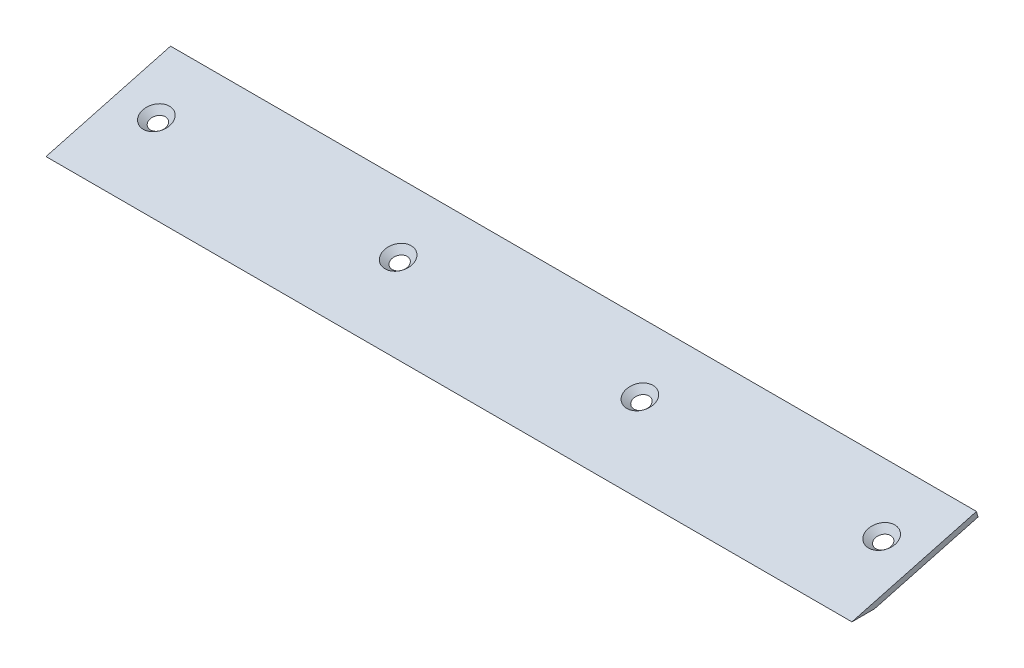
ISO-10303-21;
HEADER;
FILE_DESCRIPTION(('STEP AP214'),'2;1');
FILE_NAME('part.step','',(''),(''),'','','');
FILE_SCHEMA(('AUTOMOTIVE_DESIGN { 1 0 10303 214 1 1 1 1 }'));
ENDSEC;
DATA;
#1=APPLICATION_CONTEXT('core data for automotive mechanical design processes');
#2=APPLICATION_PROTOCOL_DEFINITION('international standard','automotive_design',2000,#1);
#3=PRODUCT_CONTEXT('',#1,'mechanical');
#4=PRODUCT('Part','Part','',(#3));
#5=PRODUCT_RELATED_PRODUCT_CATEGORY('part','',(#4));
#6=PRODUCT_DEFINITION_FORMATION('','',#4);
#7=PRODUCT_DEFINITION_CONTEXT('part definition',#1,'design');
#8=PRODUCT_DEFINITION('design','',#6,#7);
#9=PRODUCT_DEFINITION_SHAPE('','',#8);
#10=(LENGTH_UNIT() NAMED_UNIT(*) SI_UNIT(.MILLI.,.METRE.));
#11=(NAMED_UNIT(*) PLANE_ANGLE_UNIT() SI_UNIT($,.RADIAN.));
#12=(NAMED_UNIT(*) SI_UNIT($,.STERADIAN.) SOLID_ANGLE_UNIT());
#13=UNCERTAINTY_MEASURE_WITH_UNIT(LENGTH_MEASURE(1.E-05),#10,'distance_accuracy_value','');
#14=(GEOMETRIC_REPRESENTATION_CONTEXT(3) GLOBAL_UNCERTAINTY_ASSIGNED_CONTEXT((#13)) GLOBAL_UNIT_ASSIGNED_CONTEXT((#10,
#11,#12)) REPRESENTATION_CONTEXT('',''));
#15=CARTESIAN_POINT('',(0.,0.,0.));
#16=DIRECTION('',(0.,0.,1.));
#17=DIRECTION('',(1.,0.,0.));
#18=AXIS2_PLACEMENT_3D('',#15,#16,#17);
#19=CARTESIAN_POINT('',(-200.,0.,-5.60236979247659));
#20=DIRECTION('',(0.,-1.,0.));
#21=DIRECTION('',(0.,0.,-1.));
#22=AXIS2_PLACEMENT_3D('',#19,#20,#21);
#23=PLANE('',#22);
#24=DIRECTION('',(0.,0.,-1.));
#25=VECTOR('',#24,1.);
#26=CARTESIAN_POINT('',(0.,0.,-5.60236979247659));
#27=LINE('',#26,#25);
#28=CARTESIAN_POINT('',(0.,0.,0.));
#29=VERTEX_POINT('',#28);
#30=CARTESIAN_POINT('',(0.,0.,-5.60236979247659));
#31=VERTEX_POINT('',#30);
#32=EDGE_CURVE('E112',#29,#31,#27,.T.);
#33=ORIENTED_EDGE('',*,*,#32,.F.);
#34=DIRECTION('',(1.,0.,0.));
#35=VECTOR('',#34,1.);
#36=CARTESIAN_POINT('',(-200.,0.,0.));
#37=LINE('',#36,#35);
#38=CARTESIAN_POINT('',(-200.,0.,0.));
#39=VERTEX_POINT('',#38);
#40=EDGE_CURVE('E11',#39,#29,#37,.T.);
#41=ORIENTED_EDGE('',*,*,#40,.F.);
#42=DIRECTION('',(0.,0.,-1.));
#43=VECTOR('',#42,1.);
#44=CARTESIAN_POINT('',(-200.,0.,-5.60236979247659));
#45=LINE('',#44,#43);
#46=CARTESIAN_POINT('',(-200.,0.,-5.60236979247659));
#47=VERTEX_POINT('',#46);
#48=EDGE_CURVE('E103',#39,#47,#45,.T.);
#49=ORIENTED_EDGE('',*,*,#48,.T.);
#50=DIRECTION('',(1.,0.,0.));
#51=VECTOR('',#50,1.);
#52=CARTESIAN_POINT('',(-200.,0.,-5.60236979247659));
#53=LINE('',#52,#51);
#54=EDGE_CURVE('E83',#47,#31,#53,.T.);
#55=ORIENTED_EDGE('',*,*,#54,.T.);
#56=EDGE_LOOP('',(#33,#41,#49,#55));
#57=FACE_BOUND('',#56,.T.);
#58=ADVANCED_FACE('F39',(#57),#23,.T.);
#59=CARTESIAN_POINT('',(-200.,0.,0.));
#60=DIRECTION('',(0.,0.965925826289068,0.258819045102522));
#61=DIRECTION('',(0.,-0.258819045102522,0.965925826289068));
#62=AXIS2_PLACEMENT_3D('',#59,#60,#61);
#63=PLANE('',#62);
#64=CARTESIAN_POINT('',(-190.,4.65874281184539,-17.3866648732032));
#65=DIRECTION('',(0.,0.965925826289068,0.258819045102522));
#66=DIRECTION('',(0.,-0.258819045102522,0.965925826289068));
#67=AXIS2_PLACEMENT_3D('',#64,#65,#66);
#68=CIRCLE('',#67,3.36);
#69=CARTESIAN_POINT('',(-190.,3.78911082030092,-14.141154096872));
#70=VERTEX_POINT('',#69);
#71=EDGE_CURVE('E153',#70,#70,#68,.T.);
#72=ORIENTED_EDGE('',*,*,#71,.F.);
#73=EDGE_LOOP('',(#72));
#74=FACE_BOUND('',#73,.T.);
#75=CARTESIAN_POINT('',(-130.,4.65874281184539,-17.3866648732032));
#76=DIRECTION('',(0.,0.965925826289068,0.258819045102522));
#77=DIRECTION('',(0.,-0.258819045102522,0.965925826289068));
#78=AXIS2_PLACEMENT_3D('',#75,#76,#77);
#79=CIRCLE('',#78,3.36);
#80=CARTESIAN_POINT('',(-130.,3.78911082030092,-14.141154096872));
#81=VERTEX_POINT('',#80);
#82=EDGE_CURVE('E140',#81,#81,#79,.T.);
#83=ORIENTED_EDGE('',*,*,#82,.F.);
#84=EDGE_LOOP('',(#83));
#85=FACE_BOUND('',#84,.T.);
#86=CARTESIAN_POINT('',(-70.,4.65874281184539,-17.3866648732032));
#87=DIRECTION('',(0.,0.965925826289068,0.258819045102522));
#88=DIRECTION('',(0.,-0.258819045102522,0.965925826289068));
#89=AXIS2_PLACEMENT_3D('',#86,#87,#88);
#90=CIRCLE('',#89,3.36);
#91=CARTESIAN_POINT('',(-70.,3.78911082030092,-14.141154096872));
#92=VERTEX_POINT('',#91);
#93=EDGE_CURVE('E136',#92,#92,#90,.T.);
#94=ORIENTED_EDGE('',*,*,#93,.F.);
#95=EDGE_LOOP('',(#94));
#96=FACE_BOUND('',#95,.T.);
#97=CARTESIAN_POINT('',(-10.,4.65874281184539,-17.3866648732032));
#98=DIRECTION('',(0.,0.965925826289068,0.258819045102522));
#99=DIRECTION('',(0.,-0.258819045102522,0.965925826289068));
#100=AXIS2_PLACEMENT_3D('',#97,#98,#99);
#101=CIRCLE('',#100,3.36);
#102=CARTESIAN_POINT('',(-10.,3.78911082030092,-14.141154096872));
#103=VERTEX_POINT('',#102);
#104=EDGE_CURVE('E132',#103,#103,#101,.T.);
#105=ORIENTED_EDGE('',*,*,#104,.F.);
#106=EDGE_LOOP('',(#105));
#107=FACE_BOUND('',#106,.T.);
#108=DIRECTION('',(0.,-0.258819045102522,0.965925826289068));
#109=VECTOR('',#108,1.);
#110=CARTESIAN_POINT('',(0.,0.,0.));
#111=LINE('',#110,#109);
#112=CARTESIAN_POINT('',(0.,8.28220944328069,-30.9096264412502));
#113=VERTEX_POINT('',#112);
#114=EDGE_CURVE('E106',#113,#29,#111,.T.);
#115=ORIENTED_EDGE('',*,*,#114,.F.);
#116=DIRECTION('',(1.,0.,0.));
#117=VECTOR('',#116,1.);
#118=CARTESIAN_POINT('',(-200.,8.28220944328069,-30.9096264412502));
#119=LINE('',#118,#117);
#120=CARTESIAN_POINT('',(-200.,8.28220944328069,-30.9096264412502));
#121=VERTEX_POINT('',#120);
#122=EDGE_CURVE('E49',#121,#113,#119,.T.);
#123=ORIENTED_EDGE('',*,*,#122,.F.);
#124=DIRECTION('',(0.,-0.258819045102522,0.965925826289068));
#125=VECTOR('',#124,1.);
#126=CARTESIAN_POINT('',(-200.,0.,0.));
#127=LINE('',#126,#125);
#128=EDGE_CURVE('E98',#121,#39,#127,.T.);
#129=ORIENTED_EDGE('',*,*,#128,.T.);
#130=ORIENTED_EDGE('',*,*,#40,.T.);
#131=EDGE_LOOP('',(#115,#123,#129,#130));
#132=FACE_BOUND('',#131,.T.);
#133=ADVANCED_FACE('F161',(#74,#85,#96,#107,#132),#63,.T.);
#134=CARTESIAN_POINT('',(-200.,8.28220944328069,-30.9096264412502));
#135=DIRECTION('',(0.,0.258819045102523,-0.965925826289068));
#136=DIRECTION('',(0.,0.965925826289068,0.258819045102523));
#137=AXIS2_PLACEMENT_3D('',#134,#135,#136);
#138=PLANE('',#137);
#139=DIRECTION('',(0.,0.965925826289068,0.258819045102523));
#140=VECTOR('',#139,1.);
#141=CARTESIAN_POINT('',(0.,8.28220944328069,-30.9096264412502));
#142=LINE('',#141,#140);
#143=CARTESIAN_POINT('',(0.,6.88161699516154,-31.2849140566488));
#144=VERTEX_POINT('',#143);
#145=EDGE_CURVE('E91',#144,#113,#142,.T.);
#146=ORIENTED_EDGE('',*,*,#145,.F.);
#147=DIRECTION('',(1.,0.,0.));
#148=VECTOR('',#147,1.);
#149=CARTESIAN_POINT('',(-200.,6.88161699516154,-31.2849140566488));
#150=LINE('',#149,#148);
#151=CARTESIAN_POINT('',(-200.,6.88161699516154,-31.2849140566488));
#152=VERTEX_POINT('',#151);
#153=EDGE_CURVE('E86',#152,#144,#150,.T.);
#154=ORIENTED_EDGE('',*,*,#153,.F.);
#155=DIRECTION('',(0.,0.965925826289068,0.258819045102523));
#156=VECTOR('',#155,1.);
#157=CARTESIAN_POINT('',(-200.,8.28220944328069,-30.9096264412502));
#158=LINE('',#157,#156);
#159=EDGE_CURVE('E89',#152,#121,#158,.T.);
#160=ORIENTED_EDGE('',*,*,#159,.T.);
#161=ORIENTED_EDGE('',*,*,#122,.T.);
#162=EDGE_LOOP('',(#146,#154,#160,#161));
#163=FACE_BOUND('',#162,.T.);
#164=ADVANCED_FACE('F88',(#163),#138,.T.);
#165=CARTESIAN_POINT('',(-200.,6.88161699516154,-31.2849140566488));
#166=DIRECTION('',(0.,-0.965925826289068,-0.258819045102522));
#167=DIRECTION('',(0.,0.258819045102522,-0.965925826289068));
#168=AXIS2_PLACEMENT_3D('',#165,#166,#167);
#169=PLANE('',#168);
#170=CARTESIAN_POINT('',(-190.,3.25815036372624,-17.7619524886019));
#171=DIRECTION('',(0.,-0.965925826289068,-0.258819045102522));
#172=DIRECTION('',(0.,0.258819045102522,-0.965925826289068));
#173=AXIS2_PLACEMENT_3D('',#170,#171,#172);
#174=CIRCLE('',#173,1.91000000000001);
#175=CARTESIAN_POINT('',(-190.,3.75249473987206,-19.606870816814));
#176=VERTEX_POINT('',#175);
#177=EDGE_CURVE('E42',#176,#176,#174,.T.);
#178=ORIENTED_EDGE('',*,*,#177,.F.);
#179=EDGE_LOOP('',(#178));
#180=FACE_BOUND('',#179,.T.);
#181=CARTESIAN_POINT('',(-130.,3.25815036372624,-17.7619524886019));
#182=DIRECTION('',(0.,-0.965925826289068,-0.258819045102522));
#183=DIRECTION('',(0.,0.258819045102522,-0.965925826289068));
#184=AXIS2_PLACEMENT_3D('',#181,#182,#183);
#185=CIRCLE('',#184,1.91000000000001);
#186=CARTESIAN_POINT('',(-130.,3.75249473987206,-19.606870816814));
#187=VERTEX_POINT('',#186);
#188=EDGE_CURVE('E137',#187,#187,#185,.T.);
#189=ORIENTED_EDGE('',*,*,#188,.F.);
#190=EDGE_LOOP('',(#189));
#191=FACE_BOUND('',#190,.T.);
#192=CARTESIAN_POINT('',(-70.,3.25815036372624,-17.7619524886019));
#193=DIRECTION('',(0.,-0.965925826289068,-0.258819045102522));
#194=DIRECTION('',(0.,0.258819045102522,-0.965925826289068));
#195=AXIS2_PLACEMENT_3D('',#192,#193,#194);
#196=CIRCLE('',#195,1.90999999999999);
#197=CARTESIAN_POINT('',(-70.,3.75249473987206,-19.606870816814));
#198=VERTEX_POINT('',#197);
#199=EDGE_CURVE('E133',#198,#198,#196,.T.);
#200=ORIENTED_EDGE('',*,*,#199,.F.);
#201=EDGE_LOOP('',(#200));
#202=FACE_BOUND('',#201,.T.);
#203=CARTESIAN_POINT('',(-10.,3.25815036372624,-17.7619524886019));
#204=DIRECTION('',(0.,-0.965925826289068,-0.258819045102522));
#205=DIRECTION('',(0.,0.258819045102522,-0.965925826289068));
#206=AXIS2_PLACEMENT_3D('',#203,#204,#205);
#207=CIRCLE('',#206,1.91);
#208=CARTESIAN_POINT('',(-10.,3.75249473987206,-19.606870816814));
#209=VERTEX_POINT('',#208);
#210=EDGE_CURVE('E117',#209,#209,#207,.T.);
#211=ORIENTED_EDGE('',*,*,#210,.F.);
#212=EDGE_LOOP('',(#211));
#213=FACE_BOUND('',#212,.T.);
#214=DIRECTION('',(0.,0.258819045102522,-0.965925826289068));
#215=VECTOR('',#214,1.);
#216=CARTESIAN_POINT('',(0.,6.88161699516154,-31.2849140566488));
#217=LINE('',#216,#215);
#218=EDGE_CURVE('E116',#31,#144,#217,.T.);
#219=ORIENTED_EDGE('',*,*,#218,.F.);
#220=ORIENTED_EDGE('',*,*,#54,.F.);
#221=DIRECTION('',(0.,0.258819045102522,-0.965925826289068));
#222=VECTOR('',#221,1.);
#223=CARTESIAN_POINT('',(-200.,6.88161699516154,-31.2849140566488));
#224=LINE('',#223,#222);
#225=EDGE_CURVE('E97',#47,#152,#224,.T.);
#226=ORIENTED_EDGE('',*,*,#225,.T.);
#227=ORIENTED_EDGE('',*,*,#153,.T.);
#228=EDGE_LOOP('',(#219,#220,#226,#227));
#229=FACE_BOUND('',#228,.T.);
#230=ADVANCED_FACE('F101',(#180,#191,#202,#213,#229),#169,.T.);
#231=CARTESIAN_POINT('',(-200.,0.,0.));
#232=DIRECTION('',(1.,0.,0.));
#233=DIRECTION('',(0.,0.,-1.));
#234=AXIS2_PLACEMENT_3D('',#231,#232,#233);
#235=PLANE('',#234);
#236=ORIENTED_EDGE('',*,*,#48,.F.);
#237=ORIENTED_EDGE('',*,*,#128,.F.);
#238=ORIENTED_EDGE('',*,*,#159,.F.);
#239=ORIENTED_EDGE('',*,*,#225,.F.);
#240=EDGE_LOOP('',(#236,#237,#238,#239));
#241=FACE_BOUND('',#240,.T.);
#242=ADVANCED_FACE('F96',(#241),#235,.F.);
#243=CARTESIAN_POINT('',(0.,0.,0.));
#244=DIRECTION('',(1.,0.,0.));
#245=DIRECTION('',(0.,0.,-1.));
#246=AXIS2_PLACEMENT_3D('',#243,#244,#245);
#247=PLANE('',#246);
#248=ORIENTED_EDGE('',*,*,#32,.T.);
#249=ORIENTED_EDGE('',*,*,#218,.T.);
#250=ORIENTED_EDGE('',*,*,#145,.T.);
#251=ORIENTED_EDGE('',*,*,#114,.T.);
#252=EDGE_LOOP('',(#248,#249,#250,#251));
#253=FACE_BOUND('',#252,.T.);
#254=ADVANCED_FACE('F166',(#253),#247,.T.);
#255=CARTESIAN_POINT('',(-10.,4.65874281184539,-17.3866648732032));
#256=DIRECTION('',(0.,0.965925826289068,0.258819045102522));
#257=DIRECTION('',(0.,-0.258819045102522,0.965925826289068));
#258=AXIS2_PLACEMENT_3D('',#255,#256,#257);
#259=CONICAL_SURFACE('',#258,3.36,0.785398163397448);
#260=ORIENTED_EDGE('',*,*,#210,.T.);
#261=EDGE_LOOP('',(#260));
#262=FACE_BOUND('',#261,.T.);
#263=ORIENTED_EDGE('',*,*,#104,.T.);
#264=EDGE_LOOP('',(#263));
#265=FACE_BOUND('',#264,.T.);
#266=ADVANCED_FACE('F159',(#262,#265),#259,.F.);
#267=CARTESIAN_POINT('',(-70.,4.65874281184539,-17.3866648732032));
#268=DIRECTION('',(0.,0.965925826289068,0.258819045102522));
#269=DIRECTION('',(0.,-0.258819045102522,0.965925826289068));
#270=AXIS2_PLACEMENT_3D('',#267,#268,#269);
#271=CONICAL_SURFACE('',#270,3.36,0.78539816339745);
#272=ORIENTED_EDGE('',*,*,#199,.T.);
#273=EDGE_LOOP('',(#272));
#274=FACE_BOUND('',#273,.T.);
#275=ORIENTED_EDGE('',*,*,#93,.T.);
#276=EDGE_LOOP('',(#275));
#277=FACE_BOUND('',#276,.T.);
#278=ADVANCED_FACE('F204',(#274,#277),#271,.F.);
#279=CARTESIAN_POINT('',(-130.,4.65874281184539,-17.3866648732032));
#280=DIRECTION('',(0.,0.965925826289068,0.258819045102522));
#281=DIRECTION('',(0.,-0.258819045102522,0.965925826289068));
#282=AXIS2_PLACEMENT_3D('',#279,#280,#281);
#283=CONICAL_SURFACE('',#282,3.36,0.785398163397446);
#284=ORIENTED_EDGE('',*,*,#188,.T.);
#285=EDGE_LOOP('',(#284));
#286=FACE_BOUND('',#285,.T.);
#287=ORIENTED_EDGE('',*,*,#82,.T.);
#288=EDGE_LOOP('',(#287));
#289=FACE_BOUND('',#288,.T.);
#290=ADVANCED_FACE('F212',(#286,#289),#283,.F.);
#291=CARTESIAN_POINT('',(-190.,4.65874281184539,-17.3866648732032));
#292=DIRECTION('',(0.,0.965925826289068,0.258819045102522));
#293=DIRECTION('',(0.,-0.258819045102522,0.965925826289068));
#294=AXIS2_PLACEMENT_3D('',#291,#292,#293);
#295=CONICAL_SURFACE('',#294,3.36,0.785398163397446);
#296=ORIENTED_EDGE('',*,*,#177,.T.);
#297=EDGE_LOOP('',(#296));
#298=FACE_BOUND('',#297,.T.);
#299=ORIENTED_EDGE('',*,*,#71,.T.);
#300=EDGE_LOOP('',(#299));
#301=FACE_BOUND('',#300,.T.);
#302=ADVANCED_FACE('F220',(#298,#301),#295,.F.);
#303=CLOSED_SHELL('',(#58,#133,#164,#230,#242,#254,#266,#278,#290,#302));
#304=MANIFOLD_SOLID_BREP('B2',#303);
#305=ADVANCED_BREP_SHAPE_REPRESENTATION('',(#18,#304),#14);
#306=SHAPE_DEFINITION_REPRESENTATION(#9,#305);
ENDSEC;
END-ISO-10303-21;
